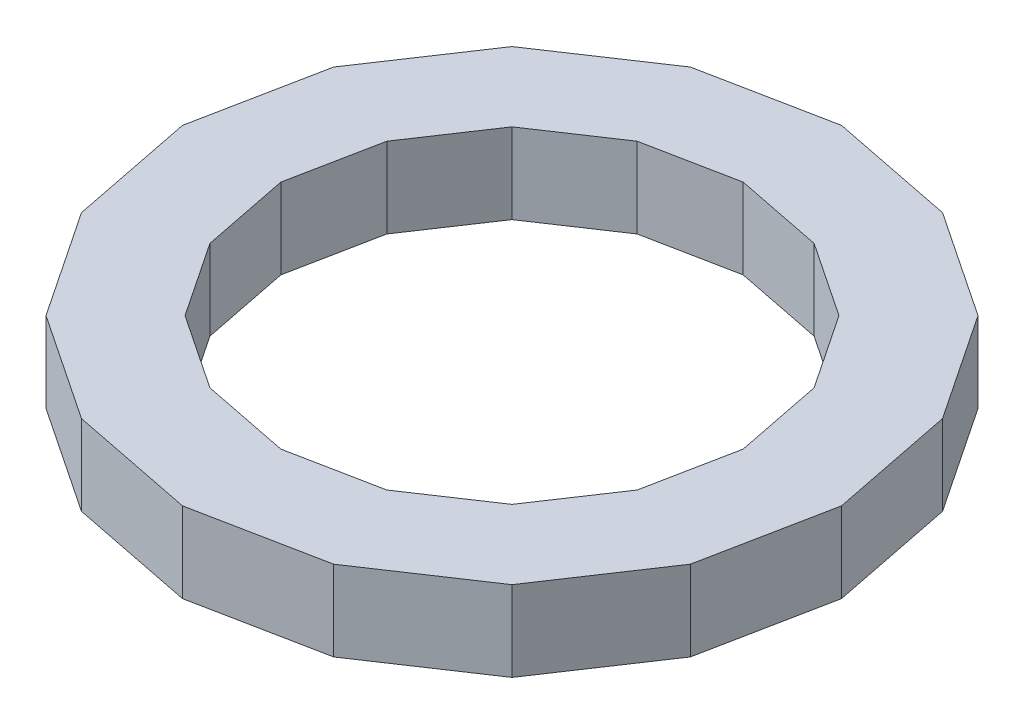
ISO-10303-21;
HEADER;
FILE_DESCRIPTION(('STEP AP214'),'2;1');
FILE_NAME('part.step','',(''),(''),'','','');
FILE_SCHEMA(('AUTOMOTIVE_DESIGN { 1 0 10303 214 1 1 1 1 }'));
ENDSEC;
DATA;
#1=APPLICATION_CONTEXT('core data for automotive mechanical design processes');
#2=APPLICATION_PROTOCOL_DEFINITION('international standard','automotive_design',2000,#1);
#3=PRODUCT_CONTEXT('',#1,'mechanical');
#4=PRODUCT('Part','Part','',(#3));
#5=PRODUCT_RELATED_PRODUCT_CATEGORY('part','',(#4));
#6=PRODUCT_DEFINITION_FORMATION('','',#4);
#7=PRODUCT_DEFINITION_CONTEXT('part definition',#1,'design');
#8=PRODUCT_DEFINITION('design','',#6,#7);
#9=PRODUCT_DEFINITION_SHAPE('','',#8);
#10=(LENGTH_UNIT() NAMED_UNIT(*) SI_UNIT(.MILLI.,.METRE.));
#11=(NAMED_UNIT(*) PLANE_ANGLE_UNIT() SI_UNIT($,.RADIAN.));
#12=(NAMED_UNIT(*) SI_UNIT($,.STERADIAN.) SOLID_ANGLE_UNIT());
#13=UNCERTAINTY_MEASURE_WITH_UNIT(LENGTH_MEASURE(1.E-05),#10,'distance_accuracy_value','');
#14=(GEOMETRIC_REPRESENTATION_CONTEXT(3) GLOBAL_UNCERTAINTY_ASSIGNED_CONTEXT((#13)) GLOBAL_UNIT_ASSIGNED_CONTEXT((#10,
#11,#12)) REPRESENTATION_CONTEXT('',''));
#15=CARTESIAN_POINT('',(0.,0.,0.));
#16=DIRECTION('',(0.,0.,1.));
#17=DIRECTION('',(1.,0.,0.));
#18=AXIS2_PLACEMENT_3D('',#15,#16,#17);
#19=CARTESIAN_POINT('',(0.,19.05,0.));
#20=DIRECTION('',(0.,1.,0.));
#21=DIRECTION('',(0.,0.,1.));
#22=AXIS2_PLACEMENT_3D('',#19,#20,#21);
#23=PLANE('',#22);
#24=DIRECTION('',(0.195090322016117,0.,-0.980785280403233));
#25=VECTOR('',#24,1.);
#26=CARTESIAN_POINT('',(72.1713098321099,19.05,29.8943353466896));
#27=LINE('',#26,#25);
#28=CARTESIAN_POINT('',(72.1713098321099,19.05,29.8943353466896));
#29=VERTEX_POINT('',#28);
#30=CARTESIAN_POINT('',(78.1176628471611,19.05,-8.84712886796927E-13));
#31=VERTEX_POINT('',#30);
#32=EDGE_CURVE('E379',#29,#31,#27,.T.);
#33=ORIENTED_EDGE('',*,*,#32,.T.);
#34=DIRECTION('',(-0.19509032201614,0.,-0.980785280403228));
#35=VECTOR('',#34,1.);
#36=CARTESIAN_POINT('',(78.1176628471611,19.05,-8.84712886796927E-13));
#37=LINE('',#36,#35);
#38=CARTESIAN_POINT('',(72.1713098321092,19.05,-29.8943353466913));
#39=VERTEX_POINT('',#38);
#40=EDGE_CURVE('E383',#31,#39,#37,.T.);
#41=ORIENTED_EDGE('',*,*,#40,.T.);
#42=DIRECTION('',(-0.555570233019612,0.,-0.831469612302539));
#43=VECTOR('',#42,1.);
#44=CARTESIAN_POINT('',(72.1713098321092,19.05,-29.8943353466913));
#45=LINE('',#44,#43);
#46=CARTESIAN_POINT('',(55.2375291296714,19.05,-55.2375291296727));
#47=VERTEX_POINT('',#46);
#48=EDGE_CURVE('E387',#39,#47,#45,.T.);
#49=ORIENTED_EDGE('',*,*,#48,.T.);
#50=DIRECTION('',(-0.831469612302552,0.,-0.555570233019592));
#51=VECTOR('',#50,1.);
#52=CARTESIAN_POINT('',(55.2375291296714,19.05,-55.2375291296727));
#53=LINE('',#52,#51);
#54=CARTESIAN_POINT('',(29.8943353466897,19.05,-72.1713098321098));
#55=VERTEX_POINT('',#54);
#56=EDGE_CURVE('E389',#47,#55,#53,.T.);
#57=ORIENTED_EDGE('',*,*,#56,.T.);
#58=DIRECTION('',(-0.980785280403233,0.,-0.195090322016116));
#59=VECTOR('',#58,1.);
#60=CARTESIAN_POINT('',(29.8943353466897,19.05,-72.1713098321098));
#61=LINE('',#60,#59);
#62=CARTESIAN_POINT('',(-9.39329143474659E-13,19.05,-78.117662847161));
#63=VERTEX_POINT('',#62);
#64=EDGE_CURVE('E392',#55,#63,#61,.T.);
#65=ORIENTED_EDGE('',*,*,#64,.T.);
#66=DIRECTION('',(-0.980785280403228,0.,0.195090322016139));
#67=VECTOR('',#66,1.);
#68=CARTESIAN_POINT('',(-9.39329143474659E-13,19.05,-78.117662847161));
#69=LINE('',#68,#67);
#70=CARTESIAN_POINT('',(-29.8943353466913,19.05,-72.1713098321091));
#71=VERTEX_POINT('',#70);
#72=EDGE_CURVE('E394',#63,#71,#69,.T.);
#73=ORIENTED_EDGE('',*,*,#72,.T.);
#74=DIRECTION('',(-0.831469612302539,0.,0.555570233019612));
#75=VECTOR('',#74,1.);
#76=CARTESIAN_POINT('',(-29.8943353466913,19.05,-72.1713098321091));
#77=LINE('',#76,#75);
#78=CARTESIAN_POINT('',(-55.2375291296727,19.05,-55.2375291296713));
#79=VERTEX_POINT('',#78);
#80=EDGE_CURVE('E397',#71,#79,#77,.T.);
#81=ORIENTED_EDGE('',*,*,#80,.T.);
#82=DIRECTION('',(-0.555570233019592,0.,0.831469612302552));
#83=VECTOR('',#82,1.);
#84=CARTESIAN_POINT('',(-55.2375291296727,19.05,-55.2375291296713));
#85=LINE('',#84,#83);
#86=CARTESIAN_POINT('',(-72.1713098321098,19.05,-29.8943353466896));
#87=VERTEX_POINT('',#86);
#88=EDGE_CURVE('E400',#79,#87,#85,.T.);
#89=ORIENTED_EDGE('',*,*,#88,.T.);
#90=DIRECTION('',(-0.195090322016117,0.,0.980785280403233));
#91=VECTOR('',#90,1.);
#92=CARTESIAN_POINT('',(-72.1713098321098,19.05,-29.8943353466896));
#93=LINE('',#92,#91);
#94=CARTESIAN_POINT('',(-78.1176628471611,19.05,9.67942693040969E-13));
#95=VERTEX_POINT('',#94);
#96=EDGE_CURVE('E403',#87,#95,#93,.T.);
#97=ORIENTED_EDGE('',*,*,#96,.T.);
#98=DIRECTION('',(0.19509032201614,0.,0.980785280403228));
#99=VECTOR('',#98,1.);
#100=CARTESIAN_POINT('',(-78.1176628471611,19.05,9.67942693040969E-13));
#101=LINE('',#100,#99);
#102=CARTESIAN_POINT('',(-72.1713098321091,19.05,29.8943353466913));
#103=VERTEX_POINT('',#102);
#104=EDGE_CURVE('E406',#95,#103,#101,.T.);
#105=ORIENTED_EDGE('',*,*,#104,.T.);
#106=DIRECTION('',(0.555570233019612,0.,0.831469612302539));
#107=VECTOR('',#106,1.);
#108=CARTESIAN_POINT('',(-72.1713098321091,19.05,29.8943353466913));
#109=LINE('',#108,#107);
#110=CARTESIAN_POINT('',(-55.2375291296714,19.05,55.2375291296727));
#111=VERTEX_POINT('',#110);
#112=EDGE_CURVE('E408',#103,#111,#109,.T.);
#113=ORIENTED_EDGE('',*,*,#112,.T.);
#114=DIRECTION('',(0.831469612302552,0.,0.555570233019593));
#115=VECTOR('',#114,1.);
#116=CARTESIAN_POINT('',(-55.2375291296714,19.05,55.2375291296727));
#117=LINE('',#116,#115);
#118=CARTESIAN_POINT('',(-29.8943353466896,19.05,72.1713098321099));
#119=VERTEX_POINT('',#118);
#120=EDGE_CURVE('E410',#111,#119,#117,.T.);
#121=ORIENTED_EDGE('',*,*,#120,.T.);
#122=DIRECTION('',(0.980785280403233,0.,0.195090322016117));
#123=VECTOR('',#122,1.);
#124=CARTESIAN_POINT('',(-29.8943353466896,19.05,72.1713098321099));
#125=LINE('',#124,#123);
#126=CARTESIAN_POINT('',(9.01558835024935E-13,19.05,78.1176628471611));
#127=VERTEX_POINT('',#126);
#128=EDGE_CURVE('E413',#119,#127,#125,.T.);
#129=ORIENTED_EDGE('',*,*,#128,.T.);
#130=DIRECTION('',(0.980785280403228,0.,-0.19509032201614));
#131=VECTOR('',#130,1.);
#132=CARTESIAN_POINT('',(9.01558835024935E-13,19.05,78.1176628471611));
#133=LINE('',#132,#131);
#134=CARTESIAN_POINT('',(29.8943353466913,19.05,72.1713098321092));
#135=VERTEX_POINT('',#134);
#136=EDGE_CURVE('E415',#127,#135,#133,.T.);
#137=ORIENTED_EDGE('',*,*,#136,.T.);
#138=DIRECTION('',(0.831469612302539,0.,-0.555570233019612));
#139=VECTOR('',#138,1.);
#140=CARTESIAN_POINT('',(29.8943353466913,19.05,72.1713098321092));
#141=LINE('',#140,#139);
#142=CARTESIAN_POINT('',(55.2375291296727,19.05,55.2375291296714));
#143=VERTEX_POINT('',#142);
#144=EDGE_CURVE('E417',#135,#143,#141,.T.);
#145=ORIENTED_EDGE('',*,*,#144,.T.);
#146=DIRECTION('',(0.555570233019593,0.,-0.831469612302552));
#147=VECTOR('',#146,1.);
#148=CARTESIAN_POINT('',(55.2375291296727,19.05,55.2375291296714));
#149=LINE('',#148,#147);
#150=EDGE_CURVE('E420',#143,#29,#149,.T.);
#151=ORIENTED_EDGE('',*,*,#150,.T.);
#152=EDGE_LOOP('',(#33,#41,#49,#57,#65,#73,#81,#89,#97,#105,#113,#121,#129,#137,#145,#151));
#153=FACE_BOUND('',#152,.T.);
#154=DIRECTION('',(-0.19509032201614,0.,-0.980785280403228));
#155=VECTOR('',#154,1.);
#156=CARTESIAN_POINT('',(54.8098089705189,19.05,-6.67431281096985E-13));
#157=LINE('',#156,#155);
#158=CARTESIAN_POINT('',(54.8098089705189,19.05,-6.67431281096985E-13));
#159=VERTEX_POINT('',#158);
#160=CARTESIAN_POINT('',(50.6376606887157,19.05,-20.9748058241137));
#161=VERTEX_POINT('',#160);
#162=EDGE_CURVE('E252',#159,#161,#157,.T.);
#163=ORIENTED_EDGE('',*,*,#162,.F.);
#164=DIRECTION('',(0.195090322016117,0.,-0.980785280403233));
#165=VECTOR('',#164,1.);
#166=CARTESIAN_POINT('',(50.6376606887162,19.05,20.9748058241125));
#167=LINE('',#166,#165);
#168=CARTESIAN_POINT('',(50.6376606887162,19.05,20.9748058241125));
#169=VERTEX_POINT('',#168);
#170=EDGE_CURVE('E243',#169,#159,#167,.T.);
#171=ORIENTED_EDGE('',*,*,#170,.F.);
#172=DIRECTION('',(0.555570233019592,0.,-0.831469612302552));
#173=VECTOR('',#172,1.);
#174=CARTESIAN_POINT('',(38.7563875985937,19.05,38.7563875985927));
#175=LINE('',#174,#173);
#176=CARTESIAN_POINT('',(38.7563875985937,19.05,38.7563875985927));
#177=VERTEX_POINT('',#176);
#178=EDGE_CURVE('E301',#177,#169,#175,.T.);
#179=ORIENTED_EDGE('',*,*,#178,.F.);
#180=DIRECTION('',(0.831469612302539,0.,-0.555570233019612));
#181=VECTOR('',#180,1.);
#182=CARTESIAN_POINT('',(20.9748058241137,19.05,50.6376606887157));
#183=LINE('',#182,#181);
#184=CARTESIAN_POINT('',(20.9748058241137,19.05,50.6376606887157));
#185=VERTEX_POINT('',#184);
#186=EDGE_CURVE('E299',#185,#177,#183,.T.);
#187=ORIENTED_EDGE('',*,*,#186,.F.);
#188=DIRECTION('',(0.980785280403228,0.,-0.19509032201614));
#189=VECTOR('',#188,1.);
#190=CARTESIAN_POINT('',(6.3850635093484E-13,19.05,54.8098089705189));
#191=LINE('',#190,#189);
#192=CARTESIAN_POINT('',(6.3850635093484E-13,19.05,54.8098089705189));
#193=VERTEX_POINT('',#192);
#194=EDGE_CURVE('E297',#193,#185,#191,.T.);
#195=ORIENTED_EDGE('',*,*,#194,.F.);
#196=DIRECTION('',(0.980785280403233,0.,0.195090322016117));
#197=VECTOR('',#196,1.);
#198=CARTESIAN_POINT('',(-20.9748058241125,19.05,50.6376606887162));
#199=LINE('',#198,#197);
#200=CARTESIAN_POINT('',(-20.9748058241125,19.05,50.6376606887162));
#201=VERTEX_POINT('',#200);
#202=EDGE_CURVE('E295',#201,#193,#199,.T.);
#203=ORIENTED_EDGE('',*,*,#202,.F.);
#204=DIRECTION('',(0.831469612302552,0.,0.555570233019592));
#205=VECTOR('',#204,1.);
#206=CARTESIAN_POINT('',(-38.7563875985927,19.05,38.7563875985937));
#207=LINE('',#206,#205);
#208=CARTESIAN_POINT('',(-38.7563875985927,19.05,38.7563875985937));
#209=VERTEX_POINT('',#208);
#210=EDGE_CURVE('E293',#209,#201,#207,.T.);
#211=ORIENTED_EDGE('',*,*,#210,.F.);
#212=DIRECTION('',(0.555570233019612,0.,0.831469612302539));
#213=VECTOR('',#212,1.);
#214=CARTESIAN_POINT('',(-50.6376606887157,19.05,20.9748058241137));
#215=LINE('',#214,#213);
#216=CARTESIAN_POINT('',(-50.6376606887157,19.05,20.9748058241137));
#217=VERTEX_POINT('',#216);
#218=EDGE_CURVE('E291',#217,#209,#215,.T.);
#219=ORIENTED_EDGE('',*,*,#218,.F.);
#220=DIRECTION('',(0.19509032201614,0.,0.980785280403228));
#221=VECTOR('',#220,1.);
#222=CARTESIAN_POINT('',(-54.8098089705189,19.05,6.47517366071042E-13));
#223=LINE('',#222,#221);
#224=CARTESIAN_POINT('',(-54.8098089705189,19.05,6.47517366071042E-13));
#225=VERTEX_POINT('',#224);
#226=EDGE_CURVE('E289',#225,#217,#223,.T.);
#227=ORIENTED_EDGE('',*,*,#226,.F.);
#228=DIRECTION('',(-0.195090322016116,0.,0.980785280403233));
#229=VECTOR('',#228,1.);
#230=CARTESIAN_POINT('',(-50.6376606887162,19.05,-20.9748058241125));
#231=LINE('',#230,#229);
#232=CARTESIAN_POINT('',(-50.6376606887162,19.05,-20.9748058241125));
#233=VERTEX_POINT('',#232);
#234=EDGE_CURVE('E287',#233,#225,#231,.T.);
#235=ORIENTED_EDGE('',*,*,#234,.F.);
#236=DIRECTION('',(-0.555570233019592,0.,0.831469612302552));
#237=VECTOR('',#236,1.);
#238=CARTESIAN_POINT('',(-38.7563875985937,19.05,-38.7563875985927));
#239=LINE('',#238,#237);
#240=CARTESIAN_POINT('',(-38.7563875985937,19.05,-38.7563875985927));
#241=VERTEX_POINT('',#240);
#242=EDGE_CURVE('E284',#241,#233,#239,.T.);
#243=ORIENTED_EDGE('',*,*,#242,.F.);
#244=DIRECTION('',(-0.831469612302538,0.,0.555570233019612));
#245=VECTOR('',#244,1.);
#246=CARTESIAN_POINT('',(-20.9748058241137,19.05,-50.6376606887157));
#247=LINE('',#246,#245);
#248=CARTESIAN_POINT('',(-20.9748058241137,19.05,-50.6376606887157));
#249=VERTEX_POINT('',#248);
#250=EDGE_CURVE('E281',#249,#241,#247,.T.);
#251=ORIENTED_EDGE('',*,*,#250,.F.);
#252=DIRECTION('',(-0.980785280403228,0.,0.19509032201614));
#253=VECTOR('',#252,1.);
#254=CARTESIAN_POINT('',(-6.64224619097692E-13,19.05,-54.809808970519));
#255=LINE('',#254,#253);
#256=CARTESIAN_POINT('',(-6.64224619097692E-13,19.05,-54.809808970519));
#257=VERTEX_POINT('',#256);
#258=EDGE_CURVE('E279',#257,#249,#255,.T.);
#259=ORIENTED_EDGE('',*,*,#258,.F.);
#260=DIRECTION('',(-0.980785280403233,0.,-0.195090322016116));
#261=VECTOR('',#260,1.);
#262=CARTESIAN_POINT('',(20.9748058241124,19.05,-50.6376606887163));
#263=LINE('',#262,#261);
#264=CARTESIAN_POINT('',(20.9748058241124,19.05,-50.6376606887163));
#265=VERTEX_POINT('',#264);
#266=EDGE_CURVE('E276',#265,#257,#263,.T.);
#267=ORIENTED_EDGE('',*,*,#266,.F.);
#268=DIRECTION('',(-0.831469612302552,0.,-0.555570233019592));
#269=VECTOR('',#268,1.);
#270=CARTESIAN_POINT('',(38.7563875985927,19.05,-38.7563875985937));
#271=LINE('',#270,#269);
#272=CARTESIAN_POINT('',(38.7563875985927,19.05,-38.7563875985937));
#273=VERTEX_POINT('',#272);
#274=EDGE_CURVE('E272',#273,#265,#271,.T.);
#275=ORIENTED_EDGE('',*,*,#274,.F.);
#276=DIRECTION('',(-0.555570233019612,0.,-0.831469612302539));
#277=VECTOR('',#276,1.);
#278=CARTESIAN_POINT('',(50.6376606887157,19.05,-20.9748058241137));
#279=LINE('',#278,#277);
#280=EDGE_CURVE('E265',#161,#273,#279,.T.);
#281=ORIENTED_EDGE('',*,*,#280,.F.);
#282=EDGE_LOOP('',(#163,#171,#179,#187,#195,#203,#211,#219,#227,#235,#243,#251,#259,#267,#275,#281));
#283=FACE_BOUND('',#282,.T.);
#284=ADVANCED_FACE('F34',(#153,#283),#23,.T.);
#285=CARTESIAN_POINT('',(0.,0.,0.));
#286=DIRECTION('',(0.,1.,0.));
#287=DIRECTION('',(0.,0.,1.));
#288=AXIS2_PLACEMENT_3D('',#285,#286,#287);
#289=PLANE('',#288);
#290=DIRECTION('',(0.195090322016117,0.,-0.980785280403233));
#291=VECTOR('',#290,1.);
#292=CARTESIAN_POINT('',(72.1713098321099,0.,29.8943353466896));
#293=LINE('',#292,#291);
#294=CARTESIAN_POINT('',(72.1713098321099,0.,29.8943353466896));
#295=VERTEX_POINT('',#294);
#296=CARTESIAN_POINT('',(78.1176628471611,0.,-8.84712886796927E-13));
#297=VERTEX_POINT('',#296);
#298=EDGE_CURVE('E260',#295,#297,#293,.T.);
#299=ORIENTED_EDGE('',*,*,#298,.F.);
#300=DIRECTION('',(0.555570233019593,0.,-0.831469612302552));
#301=VECTOR('',#300,1.);
#302=CARTESIAN_POINT('',(55.2375291296727,0.,55.2375291296714));
#303=LINE('',#302,#301);
#304=CARTESIAN_POINT('',(55.2375291296727,0.,55.2375291296714));
#305=VERTEX_POINT('',#304);
#306=EDGE_CURVE('E384',#305,#295,#303,.T.);
#307=ORIENTED_EDGE('',*,*,#306,.F.);
#308=DIRECTION('',(0.831469612302539,0.,-0.555570233019612));
#309=VECTOR('',#308,1.);
#310=CARTESIAN_POINT('',(29.8943353466913,0.,72.1713098321092));
#311=LINE('',#310,#309);
#312=CARTESIAN_POINT('',(29.8943353466913,0.,72.1713098321092));
#313=VERTEX_POINT('',#312);
#314=EDGE_CURVE('E456',#313,#305,#311,.T.);
#315=ORIENTED_EDGE('',*,*,#314,.F.);
#316=DIRECTION('',(0.980785280403228,0.,-0.19509032201614));
#317=VECTOR('',#316,1.);
#318=CARTESIAN_POINT('',(9.01558835024935E-13,0.,78.1176628471611));
#319=LINE('',#318,#317);
#320=CARTESIAN_POINT('',(9.01558835024935E-13,0.,78.1176628471611));
#321=VERTEX_POINT('',#320);
#322=EDGE_CURVE('E454',#321,#313,#319,.T.);
#323=ORIENTED_EDGE('',*,*,#322,.F.);
#324=DIRECTION('',(0.980785280403233,0.,0.195090322016117));
#325=VECTOR('',#324,1.);
#326=CARTESIAN_POINT('',(-29.8943353466896,0.,72.1713098321099));
#327=LINE('',#326,#325);
#328=CARTESIAN_POINT('',(-29.8943353466896,0.,72.1713098321099));
#329=VERTEX_POINT('',#328);
#330=EDGE_CURVE('E451',#329,#321,#327,.T.);
#331=ORIENTED_EDGE('',*,*,#330,.F.);
#332=DIRECTION('',(0.831469612302552,0.,0.555570233019593));
#333=VECTOR('',#332,1.);
#334=CARTESIAN_POINT('',(-55.2375291296714,0.,55.2375291296727));
#335=LINE('',#334,#333);
#336=CARTESIAN_POINT('',(-55.2375291296714,0.,55.2375291296727));
#337=VERTEX_POINT('',#336);
#338=EDGE_CURVE('E448',#337,#329,#335,.T.);
#339=ORIENTED_EDGE('',*,*,#338,.F.);
#340=DIRECTION('',(0.555570233019612,0.,0.831469612302539));
#341=VECTOR('',#340,1.);
#342=CARTESIAN_POINT('',(-72.1713098321091,0.,29.8943353466913));
#343=LINE('',#342,#341);
#344=CARTESIAN_POINT('',(-72.1713098321091,0.,29.8943353466913));
#345=VERTEX_POINT('',#344);
#346=EDGE_CURVE('E445',#345,#337,#343,.T.);
#347=ORIENTED_EDGE('',*,*,#346,.F.);
#348=DIRECTION('',(0.19509032201614,0.,0.980785280403228));
#349=VECTOR('',#348,1.);
#350=CARTESIAN_POINT('',(-78.1176628471611,0.,9.67942693040969E-13));
#351=LINE('',#350,#349);
#352=CARTESIAN_POINT('',(-78.1176628471611,0.,9.67942693040969E-13));
#353=VERTEX_POINT('',#352);
#354=EDGE_CURVE('E443',#353,#345,#351,.T.);
#355=ORIENTED_EDGE('',*,*,#354,.F.);
#356=DIRECTION('',(-0.195090322016117,0.,0.980785280403233));
#357=VECTOR('',#356,1.);
#358=CARTESIAN_POINT('',(-72.1713098321098,0.,-29.8943353466896));
#359=LINE('',#358,#357);
#360=CARTESIAN_POINT('',(-72.1713098321098,0.,-29.8943353466896));
#361=VERTEX_POINT('',#360);
#362=EDGE_CURVE('E441',#361,#353,#359,.T.);
#363=ORIENTED_EDGE('',*,*,#362,.F.);
#364=DIRECTION('',(-0.555570233019592,0.,0.831469612302552));
#365=VECTOR('',#364,1.);
#366=CARTESIAN_POINT('',(-55.2375291296727,0.,-55.2375291296713));
#367=LINE('',#366,#365);
#368=CARTESIAN_POINT('',(-55.2375291296727,0.,-55.2375291296713));
#369=VERTEX_POINT('',#368);
#370=EDGE_CURVE('E438',#369,#361,#367,.T.);
#371=ORIENTED_EDGE('',*,*,#370,.F.);
#372=DIRECTION('',(-0.831469612302539,0.,0.555570233019612));
#373=VECTOR('',#372,1.);
#374=CARTESIAN_POINT('',(-29.8943353466913,0.,-72.1713098321091));
#375=LINE('',#374,#373);
#376=CARTESIAN_POINT('',(-29.8943353466913,0.,-72.1713098321091));
#377=VERTEX_POINT('',#376);
#378=EDGE_CURVE('E436',#377,#369,#375,.T.);
#379=ORIENTED_EDGE('',*,*,#378,.F.);
#380=DIRECTION('',(-0.980785280403228,0.,0.195090322016139));
#381=VECTOR('',#380,1.);
#382=CARTESIAN_POINT('',(-9.39329143474659E-13,0.,-78.117662847161));
#383=LINE('',#382,#381);
#384=CARTESIAN_POINT('',(-9.39329143474659E-13,0.,-78.117662847161));
#385=VERTEX_POINT('',#384);
#386=EDGE_CURVE('E434',#385,#377,#383,.T.);
#387=ORIENTED_EDGE('',*,*,#386,.F.);
#388=DIRECTION('',(-0.980785280403233,0.,-0.195090322016116));
#389=VECTOR('',#388,1.);
#390=CARTESIAN_POINT('',(29.8943353466897,0.,-72.1713098321098));
#391=LINE('',#390,#389);
#392=CARTESIAN_POINT('',(29.8943353466897,0.,-72.1713098321098));
#393=VERTEX_POINT('',#392);
#394=EDGE_CURVE('E432',#393,#385,#391,.T.);
#395=ORIENTED_EDGE('',*,*,#394,.F.);
#396=DIRECTION('',(-0.831469612302552,0.,-0.555570233019592));
#397=VECTOR('',#396,1.);
#398=CARTESIAN_POINT('',(55.2375291296714,0.,-55.2375291296727));
#399=LINE('',#398,#397);
#400=CARTESIAN_POINT('',(55.2375291296714,0.,-55.2375291296727));
#401=VERTEX_POINT('',#400);
#402=EDGE_CURVE('E430',#401,#393,#399,.T.);
#403=ORIENTED_EDGE('',*,*,#402,.F.);
#404=DIRECTION('',(-0.555570233019612,0.,-0.831469612302539));
#405=VECTOR('',#404,1.);
#406=CARTESIAN_POINT('',(72.1713098321092,0.,-29.8943353466913));
#407=LINE('',#406,#405);
#408=CARTESIAN_POINT('',(72.1713098321092,0.,-29.8943353466913));
#409=VERTEX_POINT('',#408);
#410=EDGE_CURVE('E427',#409,#401,#407,.T.);
#411=ORIENTED_EDGE('',*,*,#410,.F.);
#412=DIRECTION('',(-0.19509032201614,0.,-0.980785280403228));
#413=VECTOR('',#412,1.);
#414=CARTESIAN_POINT('',(78.1176628471611,0.,-8.84712886796927E-13));
#415=LINE('',#414,#413);
#416=EDGE_CURVE('E425',#297,#409,#415,.T.);
#417=ORIENTED_EDGE('',*,*,#416,.F.);
#418=EDGE_LOOP('',(#299,#307,#315,#323,#331,#339,#347,#355,#363,#371,#379,#387,#395,#403,#411,#417));
#419=FACE_BOUND('',#418,.T.);
#420=DIRECTION('',(0.195090322016117,0.,-0.980785280403233));
#421=VECTOR('',#420,1.);
#422=CARTESIAN_POINT('',(50.6376606887162,0.,20.9748058241125));
#423=LINE('',#422,#421);
#424=CARTESIAN_POINT('',(50.6376606887162,0.,20.9748058241125));
#425=VERTEX_POINT('',#424);
#426=CARTESIAN_POINT('',(54.8098089705189,0.,-6.67431281096985E-13));
#427=VERTEX_POINT('',#426);
#428=EDGE_CURVE('E57',#425,#427,#423,.T.);
#429=ORIENTED_EDGE('',*,*,#428,.T.);
#430=DIRECTION('',(-0.19509032201614,0.,-0.980785280403228));
#431=VECTOR('',#430,1.);
#432=CARTESIAN_POINT('',(54.8098089705189,0.,-6.67431281096985E-13));
#433=LINE('',#432,#431);
#434=CARTESIAN_POINT('',(50.6376606887157,0.,-20.9748058241137));
#435=VERTEX_POINT('',#434);
#436=EDGE_CURVE('E259',#427,#435,#433,.T.);
#437=ORIENTED_EDGE('',*,*,#436,.T.);
#438=DIRECTION('',(-0.555570233019612,0.,-0.831469612302539));
#439=VECTOR('',#438,1.);
#440=CARTESIAN_POINT('',(50.6376606887157,0.,-20.9748058241137));
#441=LINE('',#440,#439);
#442=CARTESIAN_POINT('',(38.7563875985927,0.,-38.7563875985937));
#443=VERTEX_POINT('',#442);
#444=EDGE_CURVE('E307',#435,#443,#441,.T.);
#445=ORIENTED_EDGE('',*,*,#444,.T.);
#446=DIRECTION('',(-0.831469612302552,0.,-0.555570233019592));
#447=VECTOR('',#446,1.);
#448=CARTESIAN_POINT('',(38.7563875985927,0.,-38.7563875985937));
#449=LINE('',#448,#447);
#450=CARTESIAN_POINT('',(20.9748058241124,0.,-50.6376606887163));
#451=VERTEX_POINT('',#450);
#452=EDGE_CURVE('E311',#443,#451,#449,.T.);
#453=ORIENTED_EDGE('',*,*,#452,.T.);
#454=DIRECTION('',(-0.980785280403233,0.,-0.195090322016116));
#455=VECTOR('',#454,1.);
#456=CARTESIAN_POINT('',(20.9748058241124,0.,-50.6376606887163));
#457=LINE('',#456,#455);
#458=CARTESIAN_POINT('',(-6.64224619097692E-13,0.,-54.809808970519));
#459=VERTEX_POINT('',#458);
#460=EDGE_CURVE('E314',#451,#459,#457,.T.);
#461=ORIENTED_EDGE('',*,*,#460,.T.);
#462=DIRECTION('',(-0.980785280403228,0.,0.19509032201614));
#463=VECTOR('',#462,1.);
#464=CARTESIAN_POINT('',(-6.64224619097692E-13,0.,-54.809808970519));
#465=LINE('',#464,#463);
#466=CARTESIAN_POINT('',(-20.9748058241137,0.,-50.6376606887157));
#467=VERTEX_POINT('',#466);
#468=EDGE_CURVE('E317',#459,#467,#465,.T.);
#469=ORIENTED_EDGE('',*,*,#468,.T.);
#470=DIRECTION('',(-0.831469612302538,0.,0.555570233019612));
#471=VECTOR('',#470,1.);
#472=CARTESIAN_POINT('',(-20.9748058241137,0.,-50.6376606887157));
#473=LINE('',#472,#471);
#474=CARTESIAN_POINT('',(-38.7563875985937,0.,-38.7563875985927));
#475=VERTEX_POINT('',#474);
#476=EDGE_CURVE('E320',#467,#475,#473,.T.);
#477=ORIENTED_EDGE('',*,*,#476,.T.);
#478=DIRECTION('',(-0.555570233019592,0.,0.831469612302552));
#479=VECTOR('',#478,1.);
#480=CARTESIAN_POINT('',(-38.7563875985937,0.,-38.7563875985927));
#481=LINE('',#480,#479);
#482=CARTESIAN_POINT('',(-50.6376606887162,0.,-20.9748058241125));
#483=VERTEX_POINT('',#482);
#484=EDGE_CURVE('E323',#475,#483,#481,.T.);
#485=ORIENTED_EDGE('',*,*,#484,.T.);
#486=DIRECTION('',(-0.195090322016116,0.,0.980785280403233));
#487=VECTOR('',#486,1.);
#488=CARTESIAN_POINT('',(-50.6376606887162,0.,-20.9748058241125));
#489=LINE('',#488,#487);
#490=CARTESIAN_POINT('',(-54.8098089705189,0.,6.47517366071042E-13));
#491=VERTEX_POINT('',#490);
#492=EDGE_CURVE('E327',#483,#491,#489,.T.);
#493=ORIENTED_EDGE('',*,*,#492,.T.);
#494=DIRECTION('',(0.19509032201614,0.,0.980785280403228));
#495=VECTOR('',#494,1.);
#496=CARTESIAN_POINT('',(-54.8098089705189,0.,6.47517366071042E-13));
#497=LINE('',#496,#495);
#498=CARTESIAN_POINT('',(-50.6376606887157,0.,20.9748058241137));
#499=VERTEX_POINT('',#498);
#500=EDGE_CURVE('E330',#491,#499,#497,.T.);
#501=ORIENTED_EDGE('',*,*,#500,.T.);
#502=DIRECTION('',(0.555570233019612,0.,0.831469612302539));
#503=VECTOR('',#502,1.);
#504=CARTESIAN_POINT('',(-50.6376606887157,0.,20.9748058241137));
#505=LINE('',#504,#503);
#506=CARTESIAN_POINT('',(-38.7563875985927,0.,38.7563875985937));
#507=VERTEX_POINT('',#506);
#508=EDGE_CURVE('E333',#499,#507,#505,.T.);
#509=ORIENTED_EDGE('',*,*,#508,.T.);
#510=DIRECTION('',(0.831469612302552,0.,0.555570233019592));
#511=VECTOR('',#510,1.);
#512=CARTESIAN_POINT('',(-38.7563875985927,0.,38.7563875985937));
#513=LINE('',#512,#511);
#514=CARTESIAN_POINT('',(-20.9748058241125,0.,50.6376606887162));
#515=VERTEX_POINT('',#514);
#516=EDGE_CURVE('E336',#507,#515,#513,.T.);
#517=ORIENTED_EDGE('',*,*,#516,.T.);
#518=DIRECTION('',(0.980785280403233,0.,0.195090322016117));
#519=VECTOR('',#518,1.);
#520=CARTESIAN_POINT('',(-20.9748058241125,0.,50.6376606887162));
#521=LINE('',#520,#519);
#522=CARTESIAN_POINT('',(6.3850635093484E-13,0.,54.8098089705189));
#523=VERTEX_POINT('',#522);
#524=EDGE_CURVE('E339',#515,#523,#521,.T.);
#525=ORIENTED_EDGE('',*,*,#524,.T.);
#526=DIRECTION('',(0.980785280403228,0.,-0.19509032201614));
#527=VECTOR('',#526,1.);
#528=CARTESIAN_POINT('',(6.3850635093484E-13,0.,54.8098089705189));
#529=LINE('',#528,#527);
#530=CARTESIAN_POINT('',(20.9748058241137,0.,50.6376606887157));
#531=VERTEX_POINT('',#530);
#532=EDGE_CURVE('E342',#523,#531,#529,.T.);
#533=ORIENTED_EDGE('',*,*,#532,.T.);
#534=DIRECTION('',(0.831469612302539,0.,-0.555570233019612));
#535=VECTOR('',#534,1.);
#536=CARTESIAN_POINT('',(20.9748058241137,0.,50.6376606887157));
#537=LINE('',#536,#535);
#538=CARTESIAN_POINT('',(38.7563875985937,0.,38.7563875985927));
#539=VERTEX_POINT('',#538);
#540=EDGE_CURVE('E345',#531,#539,#537,.T.);
#541=ORIENTED_EDGE('',*,*,#540,.T.);
#542=DIRECTION('',(0.555570233019592,0.,-0.831469612302552));
#543=VECTOR('',#542,1.);
#544=CARTESIAN_POINT('',(38.7563875985937,0.,38.7563875985927));
#545=LINE('',#544,#543);
#546=EDGE_CURVE('E253',#539,#425,#545,.T.);
#547=ORIENTED_EDGE('',*,*,#546,.T.);
#548=EDGE_LOOP('',(#429,#437,#445,#453,#461,#469,#477,#485,#493,#501,#509,#517,#525,#533,#541,#547));
#549=FACE_BOUND('',#548,.T.);
#550=ADVANCED_FACE('F515',(#419,#549),#289,.F.);
#551=CARTESIAN_POINT('',(72.1713098321099,19.05,29.8943353466896));
#552=DIRECTION('',(-0.980785280403233,0.,-0.195090322016117));
#553=DIRECTION('',(-0.195090322016117,0.,0.980785280403233));
#554=AXIS2_PLACEMENT_3D('',#551,#552,#553);
#555=PLANE('',#554);
#556=ORIENTED_EDGE('',*,*,#298,.T.);
#557=DIRECTION('',(0.,-1.,0.));
#558=VECTOR('',#557,1.);
#559=CARTESIAN_POINT('',(78.1176628471611,19.05,-8.84712886796927E-13));
#560=LINE('',#559,#558);
#561=EDGE_CURVE('E11',#31,#297,#560,.T.);
#562=ORIENTED_EDGE('',*,*,#561,.F.);
#563=ORIENTED_EDGE('',*,*,#32,.F.);
#564=DIRECTION('',(0.,-1.,0.));
#565=VECTOR('',#564,1.);
#566=CARTESIAN_POINT('',(72.1713098321099,19.05,29.8943353466896));
#567=LINE('',#566,#565);
#568=EDGE_CURVE('E422',#29,#295,#567,.T.);
#569=ORIENTED_EDGE('',*,*,#568,.T.);
#570=EDGE_LOOP('',(#556,#562,#563,#569));
#571=FACE_BOUND('',#570,.T.);
#572=ADVANCED_FACE('F36',(#571),#555,.F.);
#573=CARTESIAN_POINT('',(78.1176628471611,19.05,-8.84712886796927E-13));
#574=DIRECTION('',(-0.980785280403228,0.,0.19509032201614));
#575=DIRECTION('',(0.19509032201614,0.,0.980785280403228));
#576=AXIS2_PLACEMENT_3D('',#573,#574,#575);
#577=PLANE('',#576);
#578=ORIENTED_EDGE('',*,*,#416,.T.);
#579=DIRECTION('',(0.,-1.,0.));
#580=VECTOR('',#579,1.);
#581=CARTESIAN_POINT('',(72.1713098321092,19.05,-29.8943353466913));
#582=LINE('',#581,#580);
#583=EDGE_CURVE('E42',#39,#409,#582,.T.);
#584=ORIENTED_EDGE('',*,*,#583,.F.);
#585=ORIENTED_EDGE('',*,*,#40,.F.);
#586=ORIENTED_EDGE('',*,*,#561,.T.);
#587=EDGE_LOOP('',(#578,#584,#585,#586));
#588=FACE_BOUND('',#587,.T.);
#589=ADVANCED_FACE('F532',(#588),#577,.F.);
#590=CARTESIAN_POINT('',(72.1713098321092,19.05,-29.8943353466913));
#591=DIRECTION('',(-0.831469612302539,0.,0.555570233019612));
#592=DIRECTION('',(0.555570233019612,0.,0.831469612302539));
#593=AXIS2_PLACEMENT_3D('',#590,#591,#592);
#594=PLANE('',#593);
#595=ORIENTED_EDGE('',*,*,#410,.T.);
#596=DIRECTION('',(0.,-1.,0.));
#597=VECTOR('',#596,1.);
#598=CARTESIAN_POINT('',(55.2375291296714,19.05,-55.2375291296727));
#599=LINE('',#598,#597);
#600=EDGE_CURVE('E502',#47,#401,#599,.T.);
#601=ORIENTED_EDGE('',*,*,#600,.F.);
#602=ORIENTED_EDGE('',*,*,#48,.F.);
#603=ORIENTED_EDGE('',*,*,#583,.T.);
#604=EDGE_LOOP('',(#595,#601,#602,#603));
#605=FACE_BOUND('',#604,.T.);
#606=ADVANCED_FACE('F509',(#605),#594,.F.);
#607=CARTESIAN_POINT('',(55.2375291296714,19.05,-55.2375291296727));
#608=DIRECTION('',(-0.555570233019592,0.,0.831469612302552));
#609=DIRECTION('',(0.831469612302552,0.,0.555570233019592));
#610=AXIS2_PLACEMENT_3D('',#607,#608,#609);
#611=PLANE('',#610);
#612=ORIENTED_EDGE('',*,*,#402,.T.);
#613=DIRECTION('',(0.,-1.,0.));
#614=VECTOR('',#613,1.);
#615=CARTESIAN_POINT('',(29.8943353466897,19.05,-72.1713098321098));
#616=LINE('',#615,#614);
#617=EDGE_CURVE('E499',#55,#393,#616,.T.);
#618=ORIENTED_EDGE('',*,*,#617,.F.);
#619=ORIENTED_EDGE('',*,*,#56,.F.);
#620=ORIENTED_EDGE('',*,*,#600,.T.);
#621=EDGE_LOOP('',(#612,#618,#619,#620));
#622=FACE_BOUND('',#621,.T.);
#623=ADVANCED_FACE('F521',(#622),#611,.F.);
#624=CARTESIAN_POINT('',(29.8943353466897,19.05,-72.1713098321098));
#625=DIRECTION('',(-0.195090322016116,0.,0.980785280403233));
#626=DIRECTION('',(0.980785280403233,0.,0.195090322016116));
#627=AXIS2_PLACEMENT_3D('',#624,#625,#626);
#628=PLANE('',#627);
#629=ORIENTED_EDGE('',*,*,#394,.T.);
#630=DIRECTION('',(0.,-1.,0.));
#631=VECTOR('',#630,1.);
#632=CARTESIAN_POINT('',(-9.39329143474659E-13,19.05,-78.117662847161));
#633=LINE('',#632,#631);
#634=EDGE_CURVE('E495',#63,#385,#633,.T.);
#635=ORIENTED_EDGE('',*,*,#634,.F.);
#636=ORIENTED_EDGE('',*,*,#64,.F.);
#637=ORIENTED_EDGE('',*,*,#617,.T.);
#638=EDGE_LOOP('',(#629,#635,#636,#637));
#639=FACE_BOUND('',#638,.T.);
#640=ADVANCED_FACE('F525',(#639),#628,.F.);
#641=CARTESIAN_POINT('',(-9.39329143474659E-13,19.05,-78.117662847161));
#642=DIRECTION('',(0.195090322016139,0.,0.980785280403228));
#643=DIRECTION('',(0.980785280403228,0.,-0.195090322016139));
#644=AXIS2_PLACEMENT_3D('',#641,#642,#643);
#645=PLANE('',#644);
#646=ORIENTED_EDGE('',*,*,#386,.T.);
#647=DIRECTION('',(0.,-1.,0.));
#648=VECTOR('',#647,1.);
#649=CARTESIAN_POINT('',(-29.8943353466913,19.05,-72.1713098321091));
#650=LINE('',#649,#648);
#651=EDGE_CURVE('E491',#71,#377,#650,.T.);
#652=ORIENTED_EDGE('',*,*,#651,.F.);
#653=ORIENTED_EDGE('',*,*,#72,.F.);
#654=ORIENTED_EDGE('',*,*,#634,.T.);
#655=EDGE_LOOP('',(#646,#652,#653,#654));
#656=FACE_BOUND('',#655,.T.);
#657=ADVANCED_FACE('F585',(#656),#645,.F.);
#658=CARTESIAN_POINT('',(-29.8943353466913,19.05,-72.1713098321091));
#659=DIRECTION('',(0.555570233019612,0.,0.831469612302539));
#660=DIRECTION('',(0.831469612302539,0.,-0.555570233019612));
#661=AXIS2_PLACEMENT_3D('',#658,#659,#660);
#662=PLANE('',#661);
#663=ORIENTED_EDGE('',*,*,#378,.T.);
#664=DIRECTION('',(0.,-1.,0.));
#665=VECTOR('',#664,1.);
#666=CARTESIAN_POINT('',(-55.2375291296727,19.05,-55.2375291296713));
#667=LINE('',#666,#665);
#668=EDGE_CURVE('E488',#79,#369,#667,.T.);
#669=ORIENTED_EDGE('',*,*,#668,.F.);
#670=ORIENTED_EDGE('',*,*,#80,.F.);
#671=ORIENTED_EDGE('',*,*,#651,.T.);
#672=EDGE_LOOP('',(#663,#669,#670,#671));
#673=FACE_BOUND('',#672,.T.);
#674=ADVANCED_FACE('F582',(#673),#662,.F.);
#675=CARTESIAN_POINT('',(-55.2375291296727,19.05,-55.2375291296713));
#676=DIRECTION('',(0.831469612302552,0.,0.555570233019592));
#677=DIRECTION('',(0.555570233019592,0.,-0.831469612302552));
#678=AXIS2_PLACEMENT_3D('',#675,#676,#677);
#679=PLANE('',#678);
#680=ORIENTED_EDGE('',*,*,#370,.T.);
#681=DIRECTION('',(0.,-1.,0.));
#682=VECTOR('',#681,1.);
#683=CARTESIAN_POINT('',(-72.1713098321098,19.05,-29.8943353466896));
#684=LINE('',#683,#682);
#685=EDGE_CURVE('E484',#87,#361,#684,.T.);
#686=ORIENTED_EDGE('',*,*,#685,.F.);
#687=ORIENTED_EDGE('',*,*,#88,.F.);
#688=ORIENTED_EDGE('',*,*,#668,.T.);
#689=EDGE_LOOP('',(#680,#686,#687,#688));
#690=FACE_BOUND('',#689,.T.);
#691=ADVANCED_FACE('F578',(#690),#679,.F.);
#692=CARTESIAN_POINT('',(-72.1713098321098,19.05,-29.8943353466896));
#693=DIRECTION('',(0.980785280403233,0.,0.195090322016117));
#694=DIRECTION('',(0.195090322016117,0.,-0.980785280403233));
#695=AXIS2_PLACEMENT_3D('',#692,#693,#694);
#696=PLANE('',#695);
#697=ORIENTED_EDGE('',*,*,#362,.T.);
#698=DIRECTION('',(0.,-1.,0.));
#699=VECTOR('',#698,1.);
#700=CARTESIAN_POINT('',(-78.1176628471611,19.05,9.67942693040969E-13));
#701=LINE('',#700,#699);
#702=EDGE_CURVE('E480',#95,#353,#701,.T.);
#703=ORIENTED_EDGE('',*,*,#702,.F.);
#704=ORIENTED_EDGE('',*,*,#96,.F.);
#705=ORIENTED_EDGE('',*,*,#685,.T.);
#706=EDGE_LOOP('',(#697,#703,#704,#705));
#707=FACE_BOUND('',#706,.T.);
#708=ADVANCED_FACE('F574',(#707),#696,.F.);
#709=CARTESIAN_POINT('',(-78.1176628471611,19.05,9.67942693040969E-13));
#710=DIRECTION('',(0.980785280403228,0.,-0.19509032201614));
#711=DIRECTION('',(-0.19509032201614,0.,-0.980785280403228));
#712=AXIS2_PLACEMENT_3D('',#709,#710,#711);
#713=PLANE('',#712);
#714=ORIENTED_EDGE('',*,*,#354,.T.);
#715=DIRECTION('',(0.,-1.,0.));
#716=VECTOR('',#715,1.);
#717=CARTESIAN_POINT('',(-72.1713098321091,19.05,29.8943353466913));
#718=LINE('',#717,#716);
#719=EDGE_CURVE('E477',#103,#345,#718,.T.);
#720=ORIENTED_EDGE('',*,*,#719,.F.);
#721=ORIENTED_EDGE('',*,*,#104,.F.);
#722=ORIENTED_EDGE('',*,*,#702,.T.);
#723=EDGE_LOOP('',(#714,#720,#721,#722));
#724=FACE_BOUND('',#723,.T.);
#725=ADVANCED_FACE('F569',(#724),#713,.F.);
#726=CARTESIAN_POINT('',(-72.1713098321091,19.05,29.8943353466913));
#727=DIRECTION('',(0.831469612302539,0.,-0.555570233019612));
#728=DIRECTION('',(-0.555570233019612,0.,-0.831469612302539));
#729=AXIS2_PLACEMENT_3D('',#726,#727,#728);
#730=PLANE('',#729);
#731=ORIENTED_EDGE('',*,*,#346,.T.);
#732=DIRECTION('',(0.,-1.,0.));
#733=VECTOR('',#732,1.);
#734=CARTESIAN_POINT('',(-55.2375291296714,19.05,55.2375291296727));
#735=LINE('',#734,#733);
#736=EDGE_CURVE('E474',#111,#337,#735,.T.);
#737=ORIENTED_EDGE('',*,*,#736,.F.);
#738=ORIENTED_EDGE('',*,*,#112,.F.);
#739=ORIENTED_EDGE('',*,*,#719,.T.);
#740=EDGE_LOOP('',(#731,#737,#738,#739));
#741=FACE_BOUND('',#740,.T.);
#742=ADVANCED_FACE('F563',(#741),#730,.F.);
#743=CARTESIAN_POINT('',(-55.2375291296714,19.05,55.2375291296727));
#744=DIRECTION('',(0.555570233019592,0.,-0.831469612302552));
#745=DIRECTION('',(-0.831469612302552,0.,-0.555570233019593));
#746=AXIS2_PLACEMENT_3D('',#743,#744,#745);
#747=PLANE('',#746);
#748=ORIENTED_EDGE('',*,*,#338,.T.);
#749=DIRECTION('',(0.,-1.,0.));
#750=VECTOR('',#749,1.);
#751=CARTESIAN_POINT('',(-29.8943353466896,19.05,72.1713098321099));
#752=LINE('',#751,#750);
#753=EDGE_CURVE('E471',#119,#329,#752,.T.);
#754=ORIENTED_EDGE('',*,*,#753,.F.);
#755=ORIENTED_EDGE('',*,*,#120,.F.);
#756=ORIENTED_EDGE('',*,*,#736,.T.);
#757=EDGE_LOOP('',(#748,#754,#755,#756));
#758=FACE_BOUND('',#757,.T.);
#759=ADVANCED_FACE('F559',(#758),#747,.F.);
#760=CARTESIAN_POINT('',(-29.8943353466896,19.05,72.1713098321099));
#761=DIRECTION('',(0.195090322016117,0.,-0.980785280403233));
#762=DIRECTION('',(-0.980785280403233,0.,-0.195090322016117));
#763=AXIS2_PLACEMENT_3D('',#760,#761,#762);
#764=PLANE('',#763);
#765=ORIENTED_EDGE('',*,*,#330,.T.);
#766=DIRECTION('',(0.,-1.,0.));
#767=VECTOR('',#766,1.);
#768=CARTESIAN_POINT('',(9.01558835024935E-13,19.05,78.1176628471611));
#769=LINE('',#768,#767);
#770=EDGE_CURVE('E468',#127,#321,#769,.T.);
#771=ORIENTED_EDGE('',*,*,#770,.F.);
#772=ORIENTED_EDGE('',*,*,#128,.F.);
#773=ORIENTED_EDGE('',*,*,#753,.T.);
#774=EDGE_LOOP('',(#765,#771,#772,#773));
#775=FACE_BOUND('',#774,.T.);
#776=ADVANCED_FACE('F554',(#775),#764,.F.);
#777=CARTESIAN_POINT('',(9.01558835024935E-13,19.05,78.1176628471611));
#778=DIRECTION('',(-0.19509032201614,0.,-0.980785280403228));
#779=DIRECTION('',(-0.980785280403228,0.,0.19509032201614));
#780=AXIS2_PLACEMENT_3D('',#777,#778,#779);
#781=PLANE('',#780);
#782=ORIENTED_EDGE('',*,*,#322,.T.);
#783=DIRECTION('',(0.,-1.,0.));
#784=VECTOR('',#783,1.);
#785=CARTESIAN_POINT('',(29.8943353466913,19.05,72.1713098321092));
#786=LINE('',#785,#784);
#787=EDGE_CURVE('E465',#135,#313,#786,.T.);
#788=ORIENTED_EDGE('',*,*,#787,.F.);
#789=ORIENTED_EDGE('',*,*,#136,.F.);
#790=ORIENTED_EDGE('',*,*,#770,.T.);
#791=EDGE_LOOP('',(#782,#788,#789,#790));
#792=FACE_BOUND('',#791,.T.);
#793=ADVANCED_FACE('F548',(#792),#781,.F.);
#794=CARTESIAN_POINT('',(29.8943353466913,19.05,72.1713098321092));
#795=DIRECTION('',(-0.555570233019612,0.,-0.831469612302539));
#796=DIRECTION('',(-0.831469612302539,0.,0.555570233019612));
#797=AXIS2_PLACEMENT_3D('',#794,#795,#796);
#798=PLANE('',#797);
#799=ORIENTED_EDGE('',*,*,#314,.T.);
#800=DIRECTION('',(0.,-1.,0.));
#801=VECTOR('',#800,1.);
#802=CARTESIAN_POINT('',(55.2375291296727,19.05,55.2375291296714));
#803=LINE('',#802,#801);
#804=EDGE_CURVE('E462',#143,#305,#803,.T.);
#805=ORIENTED_EDGE('',*,*,#804,.F.);
#806=ORIENTED_EDGE('',*,*,#144,.F.);
#807=ORIENTED_EDGE('',*,*,#787,.T.);
#808=EDGE_LOOP('',(#799,#805,#806,#807));
#809=FACE_BOUND('',#808,.T.);
#810=ADVANCED_FACE('F544',(#809),#798,.F.);
#811=CARTESIAN_POINT('',(55.2375291296727,19.05,55.2375291296714));
#812=DIRECTION('',(-0.831469612302552,0.,-0.555570233019593));
#813=DIRECTION('',(-0.555570233019593,0.,0.831469612302552));
#814=AXIS2_PLACEMENT_3D('',#811,#812,#813);
#815=PLANE('',#814);
#816=ORIENTED_EDGE('',*,*,#306,.T.);
#817=ORIENTED_EDGE('',*,*,#568,.F.);
#818=ORIENTED_EDGE('',*,*,#150,.F.);
#819=ORIENTED_EDGE('',*,*,#804,.T.);
#820=EDGE_LOOP('',(#816,#817,#818,#819));
#821=FACE_BOUND('',#820,.T.);
#822=ADVANCED_FACE('F539',(#821),#815,.F.);
#823=CARTESIAN_POINT('',(50.6376606887162,19.05,20.9748058241125));
#824=DIRECTION('',(-0.980785280403233,0.,-0.195090322016116));
#825=DIRECTION('',(-0.195090322016116,0.,0.980785280403233));
#826=AXIS2_PLACEMENT_3D('',#823,#824,#825);
#827=PLANE('',#826);
#828=ORIENTED_EDGE('',*,*,#428,.F.);
#829=DIRECTION('',(0.,-1.,0.));
#830=VECTOR('',#829,1.);
#831=CARTESIAN_POINT('',(50.6376606887162,19.05,20.9748058241125));
#832=LINE('',#831,#830);
#833=EDGE_CURVE('E247',#169,#425,#832,.T.);
#834=ORIENTED_EDGE('',*,*,#833,.F.);
#835=ORIENTED_EDGE('',*,*,#170,.T.);
#836=DIRECTION('',(0.,-1.,0.));
#837=VECTOR('',#836,1.);
#838=CARTESIAN_POINT('',(54.8098089705189,19.05,-6.67431281096985E-13));
#839=LINE('',#838,#837);
#840=EDGE_CURVE('E246',#159,#427,#839,.T.);
#841=ORIENTED_EDGE('',*,*,#840,.T.);
#842=EDGE_LOOP('',(#828,#834,#835,#841));
#843=FACE_BOUND('',#842,.T.);
#844=ADVANCED_FACE('F245',(#843),#827,.T.);
#845=CARTESIAN_POINT('',(54.8098089705189,19.05,-6.67431281096985E-13));
#846=DIRECTION('',(-0.980785280403228,0.,0.19509032201614));
#847=DIRECTION('',(0.19509032201614,0.,0.980785280403228));
#848=AXIS2_PLACEMENT_3D('',#845,#846,#847);
#849=PLANE('',#848);
#850=ORIENTED_EDGE('',*,*,#436,.F.);
#851=ORIENTED_EDGE('',*,*,#840,.F.);
#852=ORIENTED_EDGE('',*,*,#162,.T.);
#853=DIRECTION('',(0.,-1.,0.));
#854=VECTOR('',#853,1.);
#855=CARTESIAN_POINT('',(50.6376606887157,19.05,-20.9748058241137));
#856=LINE('',#855,#854);
#857=EDGE_CURVE('E261',#161,#435,#856,.T.);
#858=ORIENTED_EDGE('',*,*,#857,.T.);
#859=EDGE_LOOP('',(#850,#851,#852,#858));
#860=FACE_BOUND('',#859,.T.);
#861=ADVANCED_FACE('F256',(#860),#849,.T.);
#862=CARTESIAN_POINT('',(50.6376606887157,19.05,-20.9748058241137));
#863=DIRECTION('',(-0.831469612302539,0.,0.555570233019612));
#864=DIRECTION('',(0.555570233019612,0.,0.831469612302539));
#865=AXIS2_PLACEMENT_3D('',#862,#863,#864);
#866=PLANE('',#865);
#867=ORIENTED_EDGE('',*,*,#444,.F.);
#868=ORIENTED_EDGE('',*,*,#857,.F.);
#869=ORIENTED_EDGE('',*,*,#280,.T.);
#870=DIRECTION('',(0.,-1.,0.));
#871=VECTOR('',#870,1.);
#872=CARTESIAN_POINT('',(38.7563875985927,19.05,-38.7563875985937));
#873=LINE('',#872,#871);
#874=EDGE_CURVE('E374',#273,#443,#873,.T.);
#875=ORIENTED_EDGE('',*,*,#874,.T.);
#876=EDGE_LOOP('',(#867,#868,#869,#875));
#877=FACE_BOUND('',#876,.T.);
#878=ADVANCED_FACE('F667',(#877),#866,.T.);
#879=CARTESIAN_POINT('',(38.7563875985927,19.05,-38.7563875985937));
#880=DIRECTION('',(-0.555570233019592,0.,0.831469612302552));
#881=DIRECTION('',(0.831469612302552,0.,0.555570233019592));
#882=AXIS2_PLACEMENT_3D('',#879,#880,#881);
#883=PLANE('',#882);
#884=ORIENTED_EDGE('',*,*,#452,.F.);
#885=ORIENTED_EDGE('',*,*,#874,.F.);
#886=ORIENTED_EDGE('',*,*,#274,.T.);
#887=DIRECTION('',(0.,-1.,0.));
#888=VECTOR('',#887,1.);
#889=CARTESIAN_POINT('',(20.9748058241124,19.05,-50.6376606887163));
#890=LINE('',#889,#888);
#891=EDGE_CURVE('E372',#265,#451,#890,.T.);
#892=ORIENTED_EDGE('',*,*,#891,.T.);
#893=EDGE_LOOP('',(#884,#885,#886,#892));
#894=FACE_BOUND('',#893,.T.);
#895=ADVANCED_FACE('F673',(#894),#883,.T.);
#896=CARTESIAN_POINT('',(20.9748058241124,19.05,-50.6376606887163));
#897=DIRECTION('',(-0.195090322016116,0.,0.980785280403233));
#898=DIRECTION('',(0.980785280403233,0.,0.195090322016116));
#899=AXIS2_PLACEMENT_3D('',#896,#897,#898);
#900=PLANE('',#899);
#901=ORIENTED_EDGE('',*,*,#460,.F.);
#902=ORIENTED_EDGE('',*,*,#891,.F.);
#903=ORIENTED_EDGE('',*,*,#266,.T.);
#904=DIRECTION('',(0.,-1.,0.));
#905=VECTOR('',#904,1.);
#906=CARTESIAN_POINT('',(-6.64224619097692E-13,19.05,-54.809808970519));
#907=LINE('',#906,#905);
#908=EDGE_CURVE('E370',#257,#459,#907,.T.);
#909=ORIENTED_EDGE('',*,*,#908,.T.);
#910=EDGE_LOOP('',(#901,#902,#903,#909));
#911=FACE_BOUND('',#910,.T.);
#912=ADVANCED_FACE('F681',(#911),#900,.T.);
#913=CARTESIAN_POINT('',(-6.64224619097692E-13,19.05,-54.809808970519));
#914=DIRECTION('',(0.19509032201614,0.,0.980785280403228));
#915=DIRECTION('',(0.980785280403228,0.,-0.19509032201614));
#916=AXIS2_PLACEMENT_3D('',#913,#914,#915);
#917=PLANE('',#916);
#918=ORIENTED_EDGE('',*,*,#468,.F.);
#919=ORIENTED_EDGE('',*,*,#908,.F.);
#920=ORIENTED_EDGE('',*,*,#258,.T.);
#921=DIRECTION('',(0.,-1.,0.));
#922=VECTOR('',#921,1.);
#923=CARTESIAN_POINT('',(-20.9748058241137,19.05,-50.6376606887157));
#924=LINE('',#923,#922);
#925=EDGE_CURVE('E368',#249,#467,#924,.T.);
#926=ORIENTED_EDGE('',*,*,#925,.T.);
#927=EDGE_LOOP('',(#918,#919,#920,#926));
#928=FACE_BOUND('',#927,.T.);
#929=ADVANCED_FACE('F689',(#928),#917,.T.);
#930=CARTESIAN_POINT('',(-20.9748058241137,19.05,-50.6376606887157));
#931=DIRECTION('',(0.555570233019612,0.,0.831469612302539));
#932=DIRECTION('',(0.831469612302539,0.,-0.555570233019612));
#933=AXIS2_PLACEMENT_3D('',#930,#931,#932);
#934=PLANE('',#933);
#935=ORIENTED_EDGE('',*,*,#476,.F.);
#936=ORIENTED_EDGE('',*,*,#925,.F.);
#937=ORIENTED_EDGE('',*,*,#250,.T.);
#938=DIRECTION('',(0.,-1.,0.));
#939=VECTOR('',#938,1.);
#940=CARTESIAN_POINT('',(-38.7563875985937,19.05,-38.7563875985927));
#941=LINE('',#940,#939);
#942=EDGE_CURVE('E366',#241,#475,#941,.T.);
#943=ORIENTED_EDGE('',*,*,#942,.T.);
#944=EDGE_LOOP('',(#935,#936,#937,#943));
#945=FACE_BOUND('',#944,.T.);
#946=ADVANCED_FACE('F697',(#945),#934,.T.);
#947=CARTESIAN_POINT('',(-38.7563875985937,19.05,-38.7563875985927));
#948=DIRECTION('',(0.831469612302552,0.,0.555570233019592));
#949=DIRECTION('',(0.555570233019592,0.,-0.831469612302552));
#950=AXIS2_PLACEMENT_3D('',#947,#948,#949);
#951=PLANE('',#950);
#952=ORIENTED_EDGE('',*,*,#484,.F.);
#953=ORIENTED_EDGE('',*,*,#942,.F.);
#954=ORIENTED_EDGE('',*,*,#242,.T.);
#955=DIRECTION('',(0.,-1.,0.));
#956=VECTOR('',#955,1.);
#957=CARTESIAN_POINT('',(-50.6376606887162,19.05,-20.9748058241125));
#958=LINE('',#957,#956);
#959=EDGE_CURVE('E364',#233,#483,#958,.T.);
#960=ORIENTED_EDGE('',*,*,#959,.T.);
#961=EDGE_LOOP('',(#952,#953,#954,#960));
#962=FACE_BOUND('',#961,.T.);
#963=ADVANCED_FACE('F705',(#962),#951,.T.);
#964=CARTESIAN_POINT('',(-50.6376606887162,19.05,-20.9748058241125));
#965=DIRECTION('',(0.980785280403233,0.,0.195090322016116));
#966=DIRECTION('',(0.195090322016116,0.,-0.980785280403233));
#967=AXIS2_PLACEMENT_3D('',#964,#965,#966);
#968=PLANE('',#967);
#969=ORIENTED_EDGE('',*,*,#492,.F.);
#970=ORIENTED_EDGE('',*,*,#959,.F.);
#971=ORIENTED_EDGE('',*,*,#234,.T.);
#972=DIRECTION('',(0.,-1.,0.));
#973=VECTOR('',#972,1.);
#974=CARTESIAN_POINT('',(-54.8098089705189,19.05,6.47517366071042E-13));
#975=LINE('',#974,#973);
#976=EDGE_CURVE('E362',#225,#491,#975,.T.);
#977=ORIENTED_EDGE('',*,*,#976,.T.);
#978=EDGE_LOOP('',(#969,#970,#971,#977));
#979=FACE_BOUND('',#978,.T.);
#980=ADVANCED_FACE('F713',(#979),#968,.T.);
#981=CARTESIAN_POINT('',(-54.8098089705189,19.05,6.47517366071042E-13));
#982=DIRECTION('',(0.980785280403228,0.,-0.19509032201614));
#983=DIRECTION('',(-0.19509032201614,0.,-0.980785280403228));
#984=AXIS2_PLACEMENT_3D('',#981,#982,#983);
#985=PLANE('',#984);
#986=ORIENTED_EDGE('',*,*,#500,.F.);
#987=ORIENTED_EDGE('',*,*,#976,.F.);
#988=ORIENTED_EDGE('',*,*,#226,.T.);
#989=DIRECTION('',(0.,-1.,0.));
#990=VECTOR('',#989,1.);
#991=CARTESIAN_POINT('',(-50.6376606887157,19.05,20.9748058241137));
#992=LINE('',#991,#990);
#993=EDGE_CURVE('E360',#217,#499,#992,.T.);
#994=ORIENTED_EDGE('',*,*,#993,.T.);
#995=EDGE_LOOP('',(#986,#987,#988,#994));
#996=FACE_BOUND('',#995,.T.);
#997=ADVANCED_FACE('F721',(#996),#985,.T.);
#998=CARTESIAN_POINT('',(-50.6376606887157,19.05,20.9748058241137));
#999=DIRECTION('',(0.831469612302539,0.,-0.555570233019612));
#1000=DIRECTION('',(-0.555570233019612,0.,-0.831469612302539));
#1001=AXIS2_PLACEMENT_3D('',#998,#999,#1000);
#1002=PLANE('',#1001);
#1003=ORIENTED_EDGE('',*,*,#508,.F.);
#1004=ORIENTED_EDGE('',*,*,#993,.F.);
#1005=ORIENTED_EDGE('',*,*,#218,.T.);
#1006=DIRECTION('',(0.,-1.,0.));
#1007=VECTOR('',#1006,1.);
#1008=CARTESIAN_POINT('',(-38.7563875985927,19.05,38.7563875985937));
#1009=LINE('',#1008,#1007);
#1010=EDGE_CURVE('E358',#209,#507,#1009,.T.);
#1011=ORIENTED_EDGE('',*,*,#1010,.T.);
#1012=EDGE_LOOP('',(#1003,#1004,#1005,#1011));
#1013=FACE_BOUND('',#1012,.T.);
#1014=ADVANCED_FACE('F729',(#1013),#1002,.T.);
#1015=CARTESIAN_POINT('',(-38.7563875985927,19.05,38.7563875985937));
#1016=DIRECTION('',(0.555570233019592,0.,-0.831469612302552));
#1017=DIRECTION('',(-0.831469612302552,0.,-0.555570233019592));
#1018=AXIS2_PLACEMENT_3D('',#1015,#1016,#1017);
#1019=PLANE('',#1018);
#1020=ORIENTED_EDGE('',*,*,#516,.F.);
#1021=ORIENTED_EDGE('',*,*,#1010,.F.);
#1022=ORIENTED_EDGE('',*,*,#210,.T.);
#1023=DIRECTION('',(0.,-1.,0.));
#1024=VECTOR('',#1023,1.);
#1025=CARTESIAN_POINT('',(-20.9748058241125,19.05,50.6376606887162));
#1026=LINE('',#1025,#1024);
#1027=EDGE_CURVE('E356',#201,#515,#1026,.T.);
#1028=ORIENTED_EDGE('',*,*,#1027,.T.);
#1029=EDGE_LOOP('',(#1020,#1021,#1022,#1028));
#1030=FACE_BOUND('',#1029,.T.);
#1031=ADVANCED_FACE('F737',(#1030),#1019,.T.);
#1032=CARTESIAN_POINT('',(-20.9748058241125,19.05,50.6376606887162));
#1033=DIRECTION('',(0.195090322016117,0.,-0.980785280403233));
#1034=DIRECTION('',(-0.980785280403233,0.,-0.195090322016117));
#1035=AXIS2_PLACEMENT_3D('',#1032,#1033,#1034);
#1036=PLANE('',#1035);
#1037=ORIENTED_EDGE('',*,*,#524,.F.);
#1038=ORIENTED_EDGE('',*,*,#1027,.F.);
#1039=ORIENTED_EDGE('',*,*,#202,.T.);
#1040=DIRECTION('',(0.,-1.,0.));
#1041=VECTOR('',#1040,1.);
#1042=CARTESIAN_POINT('',(6.3850635093484E-13,19.05,54.8098089705189));
#1043=LINE('',#1042,#1041);
#1044=EDGE_CURVE('E354',#193,#523,#1043,.T.);
#1045=ORIENTED_EDGE('',*,*,#1044,.T.);
#1046=EDGE_LOOP('',(#1037,#1038,#1039,#1045));
#1047=FACE_BOUND('',#1046,.T.);
#1048=ADVANCED_FACE('F745',(#1047),#1036,.T.);
#1049=CARTESIAN_POINT('',(6.3850635093484E-13,19.05,54.8098089705189));
#1050=DIRECTION('',(-0.19509032201614,0.,-0.980785280403228));
#1051=DIRECTION('',(-0.980785280403228,0.,0.19509032201614));
#1052=AXIS2_PLACEMENT_3D('',#1049,#1050,#1051);
#1053=PLANE('',#1052);
#1054=ORIENTED_EDGE('',*,*,#532,.F.);
#1055=ORIENTED_EDGE('',*,*,#1044,.F.);
#1056=ORIENTED_EDGE('',*,*,#194,.T.);
#1057=DIRECTION('',(0.,-1.,0.));
#1058=VECTOR('',#1057,1.);
#1059=CARTESIAN_POINT('',(20.9748058241137,19.05,50.6376606887157));
#1060=LINE('',#1059,#1058);
#1061=EDGE_CURVE('E352',#185,#531,#1060,.T.);
#1062=ORIENTED_EDGE('',*,*,#1061,.T.);
#1063=EDGE_LOOP('',(#1054,#1055,#1056,#1062));
#1064=FACE_BOUND('',#1063,.T.);
#1065=ADVANCED_FACE('F753',(#1064),#1053,.T.);
#1066=CARTESIAN_POINT('',(20.9748058241137,19.05,50.6376606887157));
#1067=DIRECTION('',(-0.555570233019612,0.,-0.831469612302539));
#1068=DIRECTION('',(-0.831469612302539,0.,0.555570233019612));
#1069=AXIS2_PLACEMENT_3D('',#1066,#1067,#1068);
#1070=PLANE('',#1069);
#1071=ORIENTED_EDGE('',*,*,#540,.F.);
#1072=ORIENTED_EDGE('',*,*,#1061,.F.);
#1073=ORIENTED_EDGE('',*,*,#186,.T.);
#1074=DIRECTION('',(0.,-1.,0.));
#1075=VECTOR('',#1074,1.);
#1076=CARTESIAN_POINT('',(38.7563875985937,19.05,38.7563875985927));
#1077=LINE('',#1076,#1075);
#1078=EDGE_CURVE('E49',#177,#539,#1077,.T.);
#1079=ORIENTED_EDGE('',*,*,#1078,.T.);
#1080=EDGE_LOOP('',(#1071,#1072,#1073,#1079));
#1081=FACE_BOUND('',#1080,.T.);
#1082=ADVANCED_FACE('F761',(#1081),#1070,.T.);
#1083=CARTESIAN_POINT('',(38.7563875985937,19.05,38.7563875985927));
#1084=DIRECTION('',(-0.831469612302552,0.,-0.555570233019592));
#1085=DIRECTION('',(-0.555570233019592,0.,0.831469612302552));
#1086=AXIS2_PLACEMENT_3D('',#1083,#1084,#1085);
#1087=PLANE('',#1086);
#1088=ORIENTED_EDGE('',*,*,#546,.F.);
#1089=ORIENTED_EDGE('',*,*,#1078,.F.);
#1090=ORIENTED_EDGE('',*,*,#178,.T.);
#1091=ORIENTED_EDGE('',*,*,#833,.T.);
#1092=EDGE_LOOP('',(#1088,#1089,#1090,#1091));
#1093=FACE_BOUND('',#1092,.T.);
#1094=ADVANCED_FACE('F769',(#1093),#1087,.T.);
#1095=CLOSED_SHELL('',(#284,#550,#572,#589,#606,#623,#640,#657,#674,#691,#708,#725,#742,#759,
#776,#793,#810,#822,#844,#861,#878,#895,#912,#929,#946,#963,#980,#997,#1014,#1031,#1048,#1065,
#1082,#1094));
#1096=MANIFOLD_SOLID_BREP('B2',#1095);
#1097=ADVANCED_BREP_SHAPE_REPRESENTATION('',(#18,#1096),#14);
#1098=SHAPE_DEFINITION_REPRESENTATION(#9,#1097);
ENDSEC;
END-ISO-10303-21;
